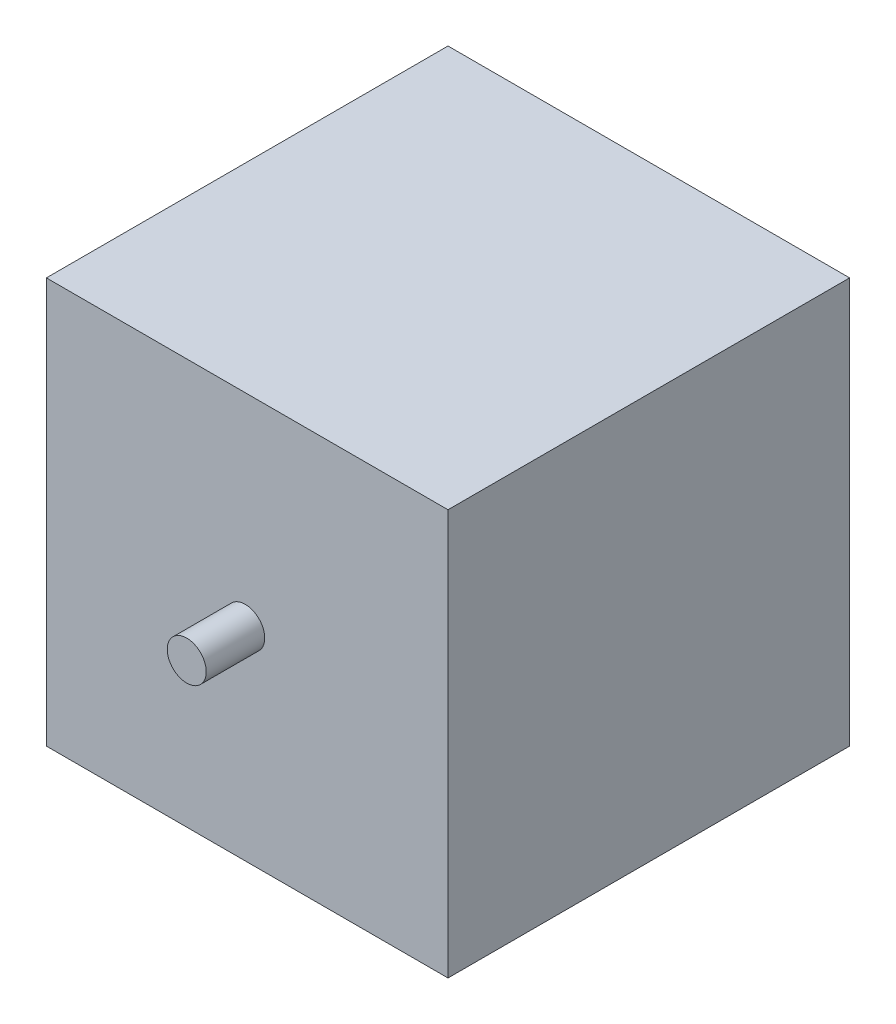
ISO-10303-21;
HEADER;
FILE_DESCRIPTION(('STEP AP214'),'2;1');
FILE_NAME('part.step','',(''),(''),'','','');
FILE_SCHEMA(('AUTOMOTIVE_DESIGN { 1 0 10303 214 1 1 1 1 }'));
ENDSEC;
DATA;
#1=APPLICATION_CONTEXT('core data for automotive mechanical design processes');
#2=APPLICATION_PROTOCOL_DEFINITION('international standard','automotive_design',2000,#1);
#3=PRODUCT_CONTEXT('',#1,'mechanical');
#4=PRODUCT('Part','Part','',(#3));
#5=PRODUCT_RELATED_PRODUCT_CATEGORY('part','',(#4));
#6=PRODUCT_DEFINITION_FORMATION('','',#4);
#7=PRODUCT_DEFINITION_CONTEXT('part definition',#1,'design');
#8=PRODUCT_DEFINITION('design','',#6,#7);
#9=PRODUCT_DEFINITION_SHAPE('','',#8);
#10=(LENGTH_UNIT() NAMED_UNIT(*) SI_UNIT(.MILLI.,.METRE.));
#11=(NAMED_UNIT(*) PLANE_ANGLE_UNIT() SI_UNIT($,.RADIAN.));
#12=(NAMED_UNIT(*) SI_UNIT($,.STERADIAN.) SOLID_ANGLE_UNIT());
#13=UNCERTAINTY_MEASURE_WITH_UNIT(LENGTH_MEASURE(1.E-05),#10,'distance_accuracy_value','');
#14=(GEOMETRIC_REPRESENTATION_CONTEXT(3) GLOBAL_UNCERTAINTY_ASSIGNED_CONTEXT((#13)) GLOBAL_UNIT_ASSIGNED_CONTEXT((#10,
#11,#12)) REPRESENTATION_CONTEXT('',''));
#15=CARTESIAN_POINT('',(0.,0.,0.));
#16=DIRECTION('',(0.,0.,1.));
#17=DIRECTION('',(1.,0.,0.));
#18=AXIS2_PLACEMENT_3D('',#15,#16,#17);
#19=CARTESIAN_POINT('',(51.5,104.,51.5));
#20=DIRECTION('',(-1.,0.,0.));
#21=DIRECTION('',(0.,0.,1.));
#22=AXIS2_PLACEMENT_3D('',#19,#20,#21);
#23=PLANE('',#22);
#24=DIRECTION('',(0.,0.,-1.));
#25=VECTOR('',#24,1.);
#26=CARTESIAN_POINT('',(51.5,0.,51.5));
#27=LINE('',#26,#25);
#28=CARTESIAN_POINT('',(51.5,0.,51.5));
#29=VERTEX_POINT('',#28);
#30=CARTESIAN_POINT('',(51.5,0.,-51.5));
#31=VERTEX_POINT('',#30);
#32=EDGE_CURVE('E114',#29,#31,#27,.T.);
#33=ORIENTED_EDGE('',*,*,#32,.T.);
#34=DIRECTION('',(0.,-1.,0.));
#35=VECTOR('',#34,1.);
#36=CARTESIAN_POINT('',(51.5,104.,-51.5));
#37=LINE('',#36,#35);
#38=CARTESIAN_POINT('',(51.5,104.,-51.5));
#39=VERTEX_POINT('',#38);
#40=EDGE_CURVE('E105',#39,#31,#37,.T.);
#41=ORIENTED_EDGE('',*,*,#40,.F.);
#42=DIRECTION('',(0.,0.,-1.));
#43=VECTOR('',#42,1.);
#44=CARTESIAN_POINT('',(51.5,104.,51.5));
#45=LINE('',#44,#43);
#46=CARTESIAN_POINT('',(51.5,104.,51.5));
#47=VERTEX_POINT('',#46);
#48=EDGE_CURVE('E99',#47,#39,#45,.T.);
#49=ORIENTED_EDGE('',*,*,#48,.F.);
#50=DIRECTION('',(0.,-1.,0.));
#51=VECTOR('',#50,1.);
#52=CARTESIAN_POINT('',(51.5,104.,51.5));
#53=LINE('',#52,#51);
#54=EDGE_CURVE('E110',#47,#29,#53,.T.);
#55=ORIENTED_EDGE('',*,*,#54,.T.);
#56=EDGE_LOOP('',(#33,#41,#49,#55));
#57=FACE_BOUND('',#56,.T.);
#58=ADVANCED_FACE('F47',(#57),#23,.F.);
#59=CARTESIAN_POINT('',(-51.5,104.,-51.5));
#60=DIRECTION('',(0.,0.,1.));
#61=DIRECTION('',(1.,0.,0.));
#62=AXIS2_PLACEMENT_3D('',#59,#60,#61);
#63=PLANE('',#62);
#64=CARTESIAN_POINT('',(-0.49999999999998,51.9975960982813,-51.5));
#65=DIRECTION('',(0.,0.,1.));
#66=DIRECTION('',(1.,0.,0.));
#67=AXIS2_PLACEMENT_3D('',#64,#65,#66);
#68=CIRCLE('',#67,5.);
#69=CARTESIAN_POINT('',(4.50000000000002,51.9975960982813,-51.5));
#70=VERTEX_POINT('',#69);
#71=EDGE_CURVE('E11',#70,#70,#68,.F.);
#72=ORIENTED_EDGE('',*,*,#71,.F.);
#73=EDGE_LOOP('',(#72));
#74=FACE_BOUND('',#73,.T.);
#75=DIRECTION('',(-1.,0.,0.));
#76=VECTOR('',#75,1.);
#77=CARTESIAN_POINT('',(-51.5,0.,-51.5));
#78=LINE('',#77,#76);
#79=CARTESIAN_POINT('',(-51.5,0.,-51.5));
#80=VERTEX_POINT('',#79);
#81=EDGE_CURVE('E104',#31,#80,#78,.T.);
#82=ORIENTED_EDGE('',*,*,#81,.T.);
#83=DIRECTION('',(0.,-1.,0.));
#84=VECTOR('',#83,1.);
#85=CARTESIAN_POINT('',(-51.5,104.,-51.5));
#86=LINE('',#85,#84);
#87=CARTESIAN_POINT('',(-51.5,104.,-51.5));
#88=VERTEX_POINT('',#87);
#89=EDGE_CURVE('E102',#88,#80,#86,.T.);
#90=ORIENTED_EDGE('',*,*,#89,.F.);
#91=DIRECTION('',(-1.,0.,0.));
#92=VECTOR('',#91,1.);
#93=CARTESIAN_POINT('',(-51.5,104.,-51.5));
#94=LINE('',#93,#92);
#95=EDGE_CURVE('E94',#39,#88,#94,.T.);
#96=ORIENTED_EDGE('',*,*,#95,.F.);
#97=ORIENTED_EDGE('',*,*,#40,.T.);
#98=EDGE_LOOP('',(#82,#90,#96,#97));
#99=FACE_BOUND('',#98,.T.);
#100=ADVANCED_FACE('F103',(#74,#99),#63,.F.);
#101=CARTESIAN_POINT('',(-51.5,104.,51.5));
#102=DIRECTION('',(1.,0.,0.));
#103=DIRECTION('',(0.,0.,-1.));
#104=AXIS2_PLACEMENT_3D('',#101,#102,#103);
#105=PLANE('',#104);
#106=CARTESIAN_POINT('',(-51.5,52.,0.));
#107=DIRECTION('',(-1.,0.,0.));
#108=DIRECTION('',(0.,0.,1.));
#109=AXIS2_PLACEMENT_3D('',#106,#107,#108);
#110=CIRCLE('',#109,17.5);
#111=CARTESIAN_POINT('',(-51.5,52.,17.5));
#112=VERTEX_POINT('',#111);
#113=EDGE_CURVE('E191',#112,#112,#110,.T.);
#114=ORIENTED_EDGE('',*,*,#113,.F.);
#115=EDGE_LOOP('',(#114));
#116=FACE_BOUND('',#115,.T.);
#117=DIRECTION('',(0.,0.,1.));
#118=VECTOR('',#117,1.);
#119=CARTESIAN_POINT('',(-51.5,0.,51.5));
#120=LINE('',#119,#118);
#121=CARTESIAN_POINT('',(-51.5,0.,51.5));
#122=VERTEX_POINT('',#121);
#123=EDGE_CURVE('E80',#80,#122,#120,.T.);
#124=ORIENTED_EDGE('',*,*,#123,.T.);
#125=DIRECTION('',(0.,-1.,0.));
#126=VECTOR('',#125,1.);
#127=CARTESIAN_POINT('',(-51.5,104.,51.5));
#128=LINE('',#127,#126);
#129=CARTESIAN_POINT('',(-51.5,104.,51.5));
#130=VERTEX_POINT('',#129);
#131=EDGE_CURVE('E106',#130,#122,#128,.T.);
#132=ORIENTED_EDGE('',*,*,#131,.F.);
#133=DIRECTION('',(0.,0.,1.));
#134=VECTOR('',#133,1.);
#135=CARTESIAN_POINT('',(-51.5,104.,51.5));
#136=LINE('',#135,#134);
#137=EDGE_CURVE('E97',#88,#130,#136,.T.);
#138=ORIENTED_EDGE('',*,*,#137,.F.);
#139=ORIENTED_EDGE('',*,*,#89,.T.);
#140=EDGE_LOOP('',(#124,#132,#138,#139));
#141=FACE_BOUND('',#140,.T.);
#142=ADVANCED_FACE('F108',(#116,#141),#105,.F.);
#143=CARTESIAN_POINT('',(-51.5,104.,51.5));
#144=DIRECTION('',(0.,0.,-1.));
#145=DIRECTION('',(-1.,0.,0.));
#146=AXIS2_PLACEMENT_3D('',#143,#144,#145);
#147=PLANE('',#146);
#148=CARTESIAN_POINT('',(-0.499999999999966,51.9975960982813,51.5));
#149=DIRECTION('',(0.,0.,-1.));
#150=DIRECTION('',(-1.,0.,0.));
#151=AXIS2_PLACEMENT_3D('',#148,#149,#150);
#152=CIRCLE('',#151,5.);
#153=CARTESIAN_POINT('',(-5.49999999999997,51.9975960982813,51.5));
#154=VERTEX_POINT('',#153);
#155=EDGE_CURVE('E55',#154,#154,#152,.F.);
#156=ORIENTED_EDGE('',*,*,#155,.F.);
#157=EDGE_LOOP('',(#156));
#158=FACE_BOUND('',#157,.T.);
#159=DIRECTION('',(1.,0.,0.));
#160=VECTOR('',#159,1.);
#161=CARTESIAN_POINT('',(-51.5,0.,51.5));
#162=LINE('',#161,#160);
#163=EDGE_CURVE('E86',#122,#29,#162,.T.);
#164=ORIENTED_EDGE('',*,*,#163,.T.);
#165=ORIENTED_EDGE('',*,*,#54,.F.);
#166=DIRECTION('',(1.,0.,0.));
#167=VECTOR('',#166,1.);
#168=CARTESIAN_POINT('',(-51.5,104.,51.5));
#169=LINE('',#168,#167);
#170=EDGE_CURVE('E63',#130,#47,#169,.T.);
#171=ORIENTED_EDGE('',*,*,#170,.F.);
#172=ORIENTED_EDGE('',*,*,#131,.T.);
#173=EDGE_LOOP('',(#164,#165,#171,#172));
#174=FACE_BOUND('',#173,.T.);
#175=ADVANCED_FACE('F128',(#158,#174),#147,.F.);
#176=CARTESIAN_POINT('',(0.,104.,0.));
#177=DIRECTION('',(0.,-1.,0.));
#178=DIRECTION('',(0.,0.,-1.));
#179=AXIS2_PLACEMENT_3D('',#176,#177,#178);
#180=PLANE('',#179);
#181=ORIENTED_EDGE('',*,*,#48,.T.);
#182=ORIENTED_EDGE('',*,*,#95,.T.);
#183=ORIENTED_EDGE('',*,*,#137,.T.);
#184=ORIENTED_EDGE('',*,*,#170,.T.);
#185=EDGE_LOOP('',(#181,#182,#183,#184));
#186=FACE_BOUND('',#185,.T.);
#187=ADVANCED_FACE('F95',(#186),#180,.F.);
#188=CARTESIAN_POINT('',(0.,0.,0.));
#189=DIRECTION('',(0.,-1.,0.));
#190=DIRECTION('',(0.,0.,-1.));
#191=AXIS2_PLACEMENT_3D('',#188,#189,#190);
#192=PLANE('',#191);
#193=ORIENTED_EDGE('',*,*,#32,.F.);
#194=ORIENTED_EDGE('',*,*,#163,.F.);
#195=ORIENTED_EDGE('',*,*,#123,.F.);
#196=ORIENTED_EDGE('',*,*,#81,.F.);
#197=EDGE_LOOP('',(#193,#194,#195,#196));
#198=FACE_BOUND('',#197,.T.);
#199=ADVANCED_FACE('F135',(#198),#192,.T.);
#200=CARTESIAN_POINT('',(-0.499999999999966,51.9975960982813,66.5));
#201=DIRECTION('',(0.,0.,-1.));
#202=DIRECTION('',(-1.,0.,0.));
#203=AXIS2_PLACEMENT_3D('',#200,#201,#202);
#204=CYLINDRICAL_SURFACE('',#203,5.);
#205=CARTESIAN_POINT('',(-0.499999999999966,51.9975960982813,66.5));
#206=DIRECTION('',(0.,0.,1.));
#207=DIRECTION('',(1.,0.,0.));
#208=AXIS2_PLACEMENT_3D('',#205,#206,#207);
#209=CIRCLE('',#208,5.);
#210=CARTESIAN_POINT('',(4.50000000000003,51.9975960982813,66.5));
#211=VERTEX_POINT('',#210);
#212=EDGE_CURVE('E117',#211,#211,#209,.T.);
#213=ORIENTED_EDGE('',*,*,#212,.F.);
#214=EDGE_LOOP('',(#213));
#215=FACE_BOUND('',#214,.T.);
#216=ORIENTED_EDGE('',*,*,#155,.T.);
#217=EDGE_LOOP('',(#216));
#218=FACE_BOUND('',#217,.T.);
#219=ADVANCED_FACE('F126',(#215,#218),#204,.T.);
#220=CARTESIAN_POINT('',(-0.499999999999966,51.9975960982813,66.5));
#221=DIRECTION('',(0.,0.,1.));
#222=DIRECTION('',(1.,0.,0.));
#223=AXIS2_PLACEMENT_3D('',#220,#221,#222);
#224=PLANE('',#223);
#225=ORIENTED_EDGE('',*,*,#212,.T.);
#226=EDGE_LOOP('',(#225));
#227=FACE_BOUND('',#226,.T.);
#228=ADVANCED_FACE('F153',(#227),#224,.T.);
#229=CARTESIAN_POINT('',(-0.49999999999998,51.9975960982813,-66.5));
#230=DIRECTION('',(0.,0.,1.));
#231=DIRECTION('',(1.,0.,0.));
#232=AXIS2_PLACEMENT_3D('',#229,#230,#231);
#233=CYLINDRICAL_SURFACE('',#232,5.);
#234=CARTESIAN_POINT('',(-0.49999999999998,51.9975960982813,-66.5));
#235=DIRECTION('',(0.,0.,-1.));
#236=DIRECTION('',(-1.,0.,0.));
#237=AXIS2_PLACEMENT_3D('',#234,#235,#236);
#238=CIRCLE('',#237,5.);
#239=CARTESIAN_POINT('',(-5.49999999999998,51.9975960982813,-66.5));
#240=VERTEX_POINT('',#239);
#241=EDGE_CURVE('E197',#240,#240,#238,.T.);
#242=ORIENTED_EDGE('',*,*,#241,.F.);
#243=EDGE_LOOP('',(#242));
#244=FACE_BOUND('',#243,.T.);
#245=ORIENTED_EDGE('',*,*,#71,.T.);
#246=EDGE_LOOP('',(#245));
#247=FACE_BOUND('',#246,.T.);
#248=ADVANCED_FACE('F159',(#244,#247),#233,.T.);
#249=CARTESIAN_POINT('',(-0.49999999999998,51.9975960982813,-66.5));
#250=DIRECTION('',(0.,0.,-1.));
#251=DIRECTION('',(-1.,0.,0.));
#252=AXIS2_PLACEMENT_3D('',#249,#250,#251);
#253=PLANE('',#252);
#254=ORIENTED_EDGE('',*,*,#241,.T.);
#255=EDGE_LOOP('',(#254));
#256=FACE_BOUND('',#255,.T.);
#257=ADVANCED_FACE('F163',(#256),#253,.T.);
#258=CARTESIAN_POINT('',(-31.5,52.,0.));
#259=DIRECTION('',(-1.,0.,0.));
#260=DIRECTION('',(0.,0.,1.));
#261=AXIS2_PLACEMENT_3D('',#258,#259,#260);
#262=CYLINDRICAL_SURFACE('',#261,17.5);
#263=CARTESIAN_POINT('',(-31.5,52.,0.));
#264=DIRECTION('',(-1.,0.,0.));
#265=DIRECTION('',(0.,0.,1.));
#266=AXIS2_PLACEMENT_3D('',#263,#264,#265);
#267=CIRCLE('',#266,17.5);
#268=CARTESIAN_POINT('',(-31.5,52.,17.5));
#269=VERTEX_POINT('',#268);
#270=EDGE_CURVE('E194',#269,#269,#267,.T.);
#271=ORIENTED_EDGE('',*,*,#270,.F.);
#272=EDGE_LOOP('',(#271));
#273=FACE_BOUND('',#272,.T.);
#274=ORIENTED_EDGE('',*,*,#113,.T.);
#275=EDGE_LOOP('',(#274));
#276=FACE_BOUND('',#275,.T.);
#277=ADVANCED_FACE('F167',(#273,#276),#262,.F.);
#278=CARTESIAN_POINT('',(-31.5,52.,0.));
#279=DIRECTION('',(-1.,0.,0.));
#280=DIRECTION('',(0.,0.,1.));
#281=AXIS2_PLACEMENT_3D('',#278,#279,#280);
#282=PLANE('',#281);
#283=CARTESIAN_POINT('',(-31.5,52.,0.));
#284=DIRECTION('',(-1.,0.,0.));
#285=DIRECTION('',(0.,0.,1.));
#286=AXIS2_PLACEMENT_3D('',#283,#284,#285);
#287=CIRCLE('',#286,12.5);
#288=CARTESIAN_POINT('',(-31.5,52.,12.5));
#289=VERTEX_POINT('',#288);
#290=EDGE_CURVE('E186',#289,#289,#287,.T.);
#291=ORIENTED_EDGE('',*,*,#290,.F.);
#292=EDGE_LOOP('',(#291));
#293=FACE_BOUND('',#292,.T.);
#294=ORIENTED_EDGE('',*,*,#270,.T.);
#295=EDGE_LOOP('',(#294));
#296=FACE_BOUND('',#295,.T.);
#297=ADVANCED_FACE('F171',(#293,#296),#282,.T.);
#298=CARTESIAN_POINT('',(-31.5,52.,0.));
#299=DIRECTION('',(-1.,0.,0.));
#300=DIRECTION('',(0.,0.,1.));
#301=AXIS2_PLACEMENT_3D('',#298,#299,#300);
#302=CYLINDRICAL_SURFACE('',#301,12.5);
#303=ORIENTED_EDGE('',*,*,#290,.T.);
#304=EDGE_LOOP('',(#303));
#305=FACE_BOUND('',#304,.T.);
#306=CARTESIAN_POINT('',(-51.5,52.,0.));
#307=DIRECTION('',(-1.,0.,0.));
#308=DIRECTION('',(0.,0.,1.));
#309=AXIS2_PLACEMENT_3D('',#306,#307,#308);
#310=CIRCLE('',#309,12.5);
#311=CARTESIAN_POINT('',(-51.5,52.,12.5));
#312=VERTEX_POINT('',#311);
#313=EDGE_CURVE('E189',#312,#312,#310,.T.);
#314=ORIENTED_EDGE('',*,*,#313,.F.);
#315=EDGE_LOOP('',(#314));
#316=FACE_BOUND('',#315,.T.);
#317=ADVANCED_FACE('F175',(#305,#316),#302,.T.);
#318=ORIENTED_EDGE('',*,*,#313,.T.);
#319=EDGE_LOOP('',(#318));
#320=FACE_BOUND('',#319,.T.);
#321=ADVANCED_FACE('F139',(#320),#105,.F.);
#322=CLOSED_SHELL('',(#58,#100,#142,#175,#187,#199,#219,#228,#248,#257,#277,#297,#317,#321));
#323=MANIFOLD_SOLID_BREP('B2',#322);
#324=ADVANCED_BREP_SHAPE_REPRESENTATION('',(#18,#323),#14);
#325=SHAPE_DEFINITION_REPRESENTATION(#9,#324);
ENDSEC;
END-ISO-10303-21;
